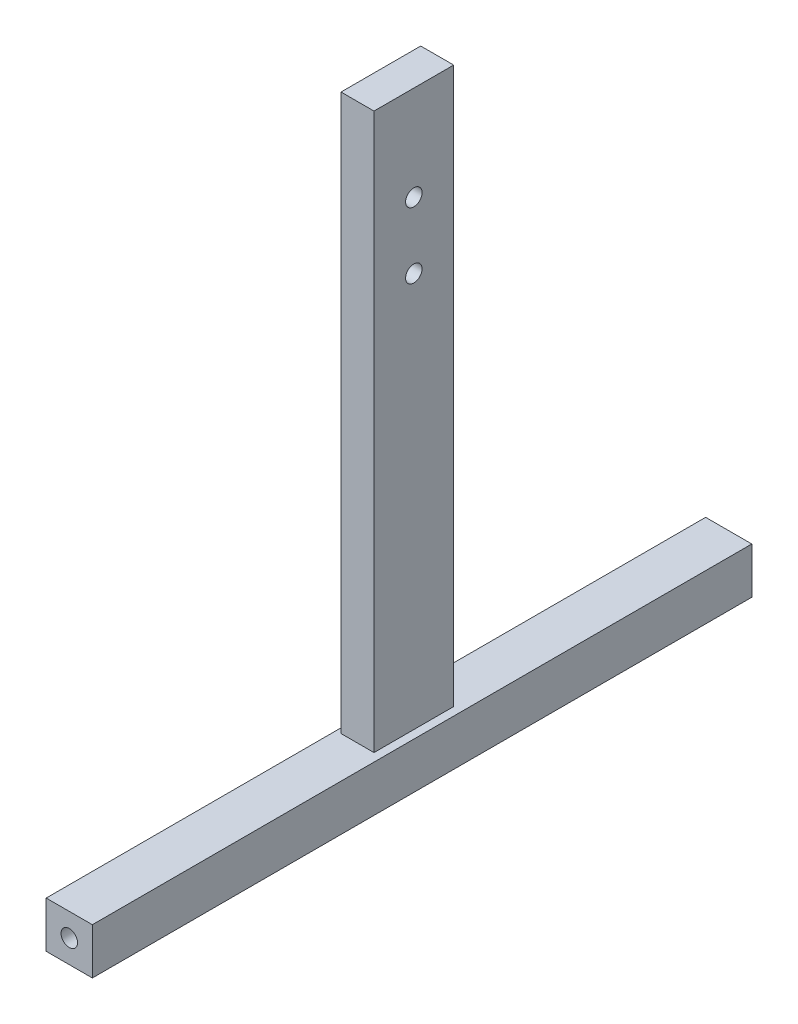
ISO-10303-21;
HEADER;
FILE_DESCRIPTION(('STEP AP214'),'2;1');
FILE_NAME('part.step','',(''),(''),'','','');
FILE_SCHEMA(('AUTOMOTIVE_DESIGN { 1 0 10303 214 1 1 1 1 }'));
ENDSEC;
DATA;
#1=APPLICATION_CONTEXT('core data for automotive mechanical design processes');
#2=APPLICATION_PROTOCOL_DEFINITION('international standard','automotive_design',2000,#1);
#3=PRODUCT_CONTEXT('',#1,'mechanical');
#4=PRODUCT('Part','Part','',(#3));
#5=PRODUCT_RELATED_PRODUCT_CATEGORY('part','',(#4));
#6=PRODUCT_DEFINITION_FORMATION('','',#4);
#7=PRODUCT_DEFINITION_CONTEXT('part definition',#1,'design');
#8=PRODUCT_DEFINITION('design','',#6,#7);
#9=PRODUCT_DEFINITION_SHAPE('','',#8);
#10=(LENGTH_UNIT() NAMED_UNIT(*) SI_UNIT(.MILLI.,.METRE.));
#11=(NAMED_UNIT(*) PLANE_ANGLE_UNIT() SI_UNIT($,.RADIAN.));
#12=(NAMED_UNIT(*) SI_UNIT($,.STERADIAN.) SOLID_ANGLE_UNIT());
#13=UNCERTAINTY_MEASURE_WITH_UNIT(LENGTH_MEASURE(1.E-05),#10,'distance_accuracy_value','');
#14=(GEOMETRIC_REPRESENTATION_CONTEXT(3) GLOBAL_UNCERTAINTY_ASSIGNED_CONTEXT((#13)) GLOBAL_UNIT_ASSIGNED_CONTEXT((#10,
#11,#12)) REPRESENTATION_CONTEXT('',''));
#15=CARTESIAN_POINT('',(0.,0.,0.));
#16=DIRECTION('',(0.,0.,1.));
#17=DIRECTION('',(1.,0.,0.));
#18=AXIS2_PLACEMENT_3D('',#15,#16,#17);
#19=CARTESIAN_POINT('',(11.43,445.77,284.697347519247));
#20=DIRECTION('',(-1.,0.,0.));
#21=DIRECTION('',(0.,0.,1.));
#22=AXIS2_PLACEMENT_3D('',#19,#20,#21);
#23=PLANE('',#22);
#24=CARTESIAN_POINT('',(11.43,372.872,253.999999999999));
#25=DIRECTION('',(-1.,0.,0.));
#26=DIRECTION('',(0.,0.,1.));
#27=AXIS2_PLACEMENT_3D('',#24,#25,#26);
#28=CIRCLE('',#27,6.34999999999999);
#29=CARTESIAN_POINT('',(11.43,372.872,260.349999999999));
#30=VERTEX_POINT('',#29);
#31=EDGE_CURVE('E140',#30,#30,#28,.T.);
#32=ORIENTED_EDGE('',*,*,#31,.T.);
#33=EDGE_LOOP('',(#32));
#34=FACE_BOUND('',#33,.T.);
#35=CARTESIAN_POINT('',(11.43,322.072,253.999999999999));
#36=DIRECTION('',(-1.,0.,0.));
#37=DIRECTION('',(0.,0.,1.));
#38=AXIS2_PLACEMENT_3D('',#35,#36,#37);
#39=CIRCLE('',#38,6.34999999999994);
#40=CARTESIAN_POINT('',(11.43,322.072,260.349999999999));
#41=VERTEX_POINT('',#40);
#42=EDGE_CURVE('E162',#41,#41,#39,.T.);
#43=ORIENTED_EDGE('',*,*,#42,.T.);
#44=EDGE_LOOP('',(#43));
#45=FACE_BOUND('',#44,.T.);
#46=DIRECTION('',(0.,0.,-1.));
#47=VECTOR('',#46,1.);
#48=CARTESIAN_POINT('',(11.43,17.78,284.697347519247));
#49=LINE('',#48,#47);
#50=CARTESIAN_POINT('',(11.43,17.78,284.697347519247));
#51=VERTEX_POINT('',#50);
#52=CARTESIAN_POINT('',(11.43,17.78,223.302652480753));
#53=VERTEX_POINT('',#52);
#54=EDGE_CURVE('E136',#51,#53,#49,.T.);
#55=ORIENTED_EDGE('',*,*,#54,.T.);
#56=DIRECTION('',(0.,-1.,0.));
#57=VECTOR('',#56,1.);
#58=CARTESIAN_POINT('',(11.43,445.77,223.302652480753));
#59=LINE('',#58,#57);
#60=CARTESIAN_POINT('',(11.43,445.77,223.302652480753));
#61=VERTEX_POINT('',#60);
#62=EDGE_CURVE('E12',#61,#53,#59,.T.);
#63=ORIENTED_EDGE('',*,*,#62,.F.);
#64=DIRECTION('',(0.,0.,-1.));
#65=VECTOR('',#64,1.);
#66=CARTESIAN_POINT('',(11.43,445.77,284.697347519247));
#67=LINE('',#66,#65);
#68=CARTESIAN_POINT('',(11.43,445.77,284.697347519247));
#69=VERTEX_POINT('',#68);
#70=EDGE_CURVE('E119',#69,#61,#67,.T.);
#71=ORIENTED_EDGE('',*,*,#70,.F.);
#72=DIRECTION('',(0.,-1.,0.));
#73=VECTOR('',#72,1.);
#74=CARTESIAN_POINT('',(11.43,445.77,284.697347519247));
#75=LINE('',#74,#73);
#76=EDGE_CURVE('E132',#69,#51,#75,.T.);
#77=ORIENTED_EDGE('',*,*,#76,.T.);
#78=EDGE_LOOP('',(#55,#63,#71,#77));
#79=FACE_BOUND('',#78,.T.);
#80=ADVANCED_FACE('F67',(#34,#45,#79),#23,.F.);
#81=CARTESIAN_POINT('',(-13.97,445.77,223.302652480753));
#82=DIRECTION('',(0.,0.,1.));
#83=DIRECTION('',(1.,0.,0.));
#84=AXIS2_PLACEMENT_3D('',#81,#82,#83);
#85=PLANE('',#84);
#86=DIRECTION('',(-1.,0.,0.));
#87=VECTOR('',#86,1.);
#88=CARTESIAN_POINT('',(-13.97,17.78,223.302652480753));
#89=LINE('',#88,#87);
#90=CARTESIAN_POINT('',(-13.97,17.78,223.302652480753));
#91=VERTEX_POINT('',#90);
#92=EDGE_CURVE('E124',#53,#91,#89,.T.);
#93=ORIENTED_EDGE('',*,*,#92,.T.);
#94=DIRECTION('',(0.,-1.,0.));
#95=VECTOR('',#94,1.);
#96=CARTESIAN_POINT('',(-13.97,445.77,223.302652480753));
#97=LINE('',#96,#95);
#98=CARTESIAN_POINT('',(-13.97,445.77,223.302652480753));
#99=VERTEX_POINT('',#98);
#100=EDGE_CURVE('E76',#99,#91,#97,.T.);
#101=ORIENTED_EDGE('',*,*,#100,.F.);
#102=DIRECTION('',(-1.,0.,0.));
#103=VECTOR('',#102,1.);
#104=CARTESIAN_POINT('',(-13.97,445.77,223.302652480753));
#105=LINE('',#104,#103);
#106=EDGE_CURVE('E114',#61,#99,#105,.T.);
#107=ORIENTED_EDGE('',*,*,#106,.F.);
#108=ORIENTED_EDGE('',*,*,#62,.T.);
#109=EDGE_LOOP('',(#93,#101,#107,#108));
#110=FACE_BOUND('',#109,.T.);
#111=ADVANCED_FACE('F123',(#110),#85,.F.);
#112=CARTESIAN_POINT('',(-13.97,445.77,284.697347519247));
#113=DIRECTION('',(1.,0.,0.));
#114=DIRECTION('',(0.,0.,-1.));
#115=AXIS2_PLACEMENT_3D('',#112,#113,#114);
#116=PLANE('',#115);
#117=CARTESIAN_POINT('',(-13.97,372.872,253.999999999999));
#118=DIRECTION('',(-1.,0.,0.));
#119=DIRECTION('',(0.,0.,1.));
#120=AXIS2_PLACEMENT_3D('',#117,#118,#119);
#121=CIRCLE('',#120,6.34999999999999);
#122=CARTESIAN_POINT('',(-13.97,372.872,260.349999999999));
#123=VERTEX_POINT('',#122);
#124=EDGE_CURVE('E166',#123,#123,#121,.T.);
#125=ORIENTED_EDGE('',*,*,#124,.F.);
#126=EDGE_LOOP('',(#125));
#127=FACE_BOUND('',#126,.T.);
#128=CARTESIAN_POINT('',(-13.97,322.072,253.999999999999));
#129=DIRECTION('',(-1.,0.,0.));
#130=DIRECTION('',(0.,0.,1.));
#131=AXIS2_PLACEMENT_3D('',#128,#129,#130);
#132=CIRCLE('',#131,6.34999999999994);
#133=CARTESIAN_POINT('',(-13.97,322.072,260.349999999999));
#134=VERTEX_POINT('',#133);
#135=EDGE_CURVE('E167',#134,#134,#132,.T.);
#136=ORIENTED_EDGE('',*,*,#135,.F.);
#137=EDGE_LOOP('',(#136));
#138=FACE_BOUND('',#137,.T.);
#139=DIRECTION('',(0.,0.,1.));
#140=VECTOR('',#139,1.);
#141=CARTESIAN_POINT('',(-13.97,17.78,284.697347519247));
#142=LINE('',#141,#140);
#143=CARTESIAN_POINT('',(-13.97,17.78,284.697347519247));
#144=VERTEX_POINT('',#143);
#145=EDGE_CURVE('E101',#91,#144,#142,.T.);
#146=ORIENTED_EDGE('',*,*,#145,.T.);
#147=DIRECTION('',(0.,-1.,0.));
#148=VECTOR('',#147,1.);
#149=CARTESIAN_POINT('',(-13.97,445.77,284.697347519247));
#150=LINE('',#149,#148);
#151=CARTESIAN_POINT('',(-13.97,445.77,284.697347519247));
#152=VERTEX_POINT('',#151);
#153=EDGE_CURVE('E126',#152,#144,#150,.T.);
#154=ORIENTED_EDGE('',*,*,#153,.F.);
#155=DIRECTION('',(0.,0.,1.));
#156=VECTOR('',#155,1.);
#157=CARTESIAN_POINT('',(-13.97,445.77,284.697347519247));
#158=LINE('',#157,#156);
#159=EDGE_CURVE('E117',#99,#152,#158,.T.);
#160=ORIENTED_EDGE('',*,*,#159,.F.);
#161=ORIENTED_EDGE('',*,*,#100,.T.);
#162=EDGE_LOOP('',(#146,#154,#160,#161));
#163=FACE_BOUND('',#162,.T.);
#164=ADVANCED_FACE('F127',(#127,#138,#163),#116,.F.);
#165=CARTESIAN_POINT('',(-13.97,445.77,284.697347519247));
#166=DIRECTION('',(0.,0.,-1.));
#167=DIRECTION('',(-1.,0.,0.));
#168=AXIS2_PLACEMENT_3D('',#165,#166,#167);
#169=PLANE('',#168);
#170=DIRECTION('',(1.,0.,0.));
#171=VECTOR('',#170,1.);
#172=CARTESIAN_POINT('',(-13.97,17.78,284.697347519247));
#173=LINE('',#172,#171);
#174=EDGE_CURVE('E107',#144,#51,#173,.T.);
#175=ORIENTED_EDGE('',*,*,#174,.T.);
#176=ORIENTED_EDGE('',*,*,#76,.F.);
#177=DIRECTION('',(1.,0.,0.));
#178=VECTOR('',#177,1.);
#179=CARTESIAN_POINT('',(-13.97,445.77,284.697347519247));
#180=LINE('',#179,#178);
#181=EDGE_CURVE('E84',#152,#69,#180,.T.);
#182=ORIENTED_EDGE('',*,*,#181,.F.);
#183=ORIENTED_EDGE('',*,*,#153,.T.);
#184=EDGE_LOOP('',(#175,#176,#182,#183));
#185=FACE_BOUND('',#184,.T.);
#186=ADVANCED_FACE('F151',(#185),#169,.F.);
#187=CARTESIAN_POINT('',(0.,445.77,0.));
#188=DIRECTION('',(0.,-1.,0.));
#189=DIRECTION('',(0.,0.,-1.));
#190=AXIS2_PLACEMENT_3D('',#187,#188,#189);
#191=PLANE('',#190);
#192=ORIENTED_EDGE('',*,*,#70,.T.);
#193=ORIENTED_EDGE('',*,*,#106,.T.);
#194=ORIENTED_EDGE('',*,*,#159,.T.);
#195=ORIENTED_EDGE('',*,*,#181,.T.);
#196=EDGE_LOOP('',(#192,#193,#194,#195));
#197=FACE_BOUND('',#196,.T.);
#198=ADVANCED_FACE('F115',(#197),#191,.F.);
#199=CARTESIAN_POINT('',(0.,17.78,0.));
#200=DIRECTION('',(0.,-1.,0.));
#201=DIRECTION('',(0.,0.,-1.));
#202=AXIS2_PLACEMENT_3D('',#199,#200,#201);
#203=PLANE('',#202);
#204=ORIENTED_EDGE('',*,*,#54,.F.);
#205=ORIENTED_EDGE('',*,*,#174,.F.);
#206=ORIENTED_EDGE('',*,*,#145,.F.);
#207=ORIENTED_EDGE('',*,*,#92,.F.);
#208=EDGE_LOOP('',(#204,#205,#206,#207));
#209=FACE_BOUND('',#208,.T.);
#210=ADVANCED_FACE('F154',(#209),#203,.T.);
#211=CARTESIAN_POINT('',(17.78,322.072,253.999999999999));
#212=DIRECTION('',(-1.,0.,0.));
#213=DIRECTION('',(0.,0.,1.));
#214=AXIS2_PLACEMENT_3D('',#211,#212,#213);
#215=CYLINDRICAL_SURFACE('',#214,6.34999999999994);
#216=ORIENTED_EDGE('',*,*,#135,.T.);
#217=EDGE_LOOP('',(#216));
#218=FACE_BOUND('',#217,.T.);
#219=ORIENTED_EDGE('',*,*,#42,.F.);
#220=EDGE_LOOP('',(#219));
#221=FACE_BOUND('',#220,.T.);
#222=ADVANCED_FACE('F184',(#218,#221),#215,.F.);
#223=CARTESIAN_POINT('',(17.78,372.872,253.999999999999));
#224=DIRECTION('',(-1.,0.,0.));
#225=DIRECTION('',(0.,0.,1.));
#226=AXIS2_PLACEMENT_3D('',#223,#224,#225);
#227=CYLINDRICAL_SURFACE('',#226,6.34999999999999);
#228=ORIENTED_EDGE('',*,*,#124,.T.);
#229=EDGE_LOOP('',(#228));
#230=FACE_BOUND('',#229,.T.);
#231=ORIENTED_EDGE('',*,*,#31,.F.);
#232=EDGE_LOOP('',(#231));
#233=FACE_BOUND('',#232,.T.);
#234=ADVANCED_FACE('F176',(#230,#233),#227,.F.);
#235=CLOSED_SHELL('',(#80,#111,#164,#186,#198,#210,#222,#234));
#236=MANIFOLD_SOLID_BREP('B2',#235);
#237=CARTESIAN_POINT('',(17.78,17.78,508.));
#238=DIRECTION('',(-1.,0.,0.));
#239=DIRECTION('',(0.,-1.,0.));
#240=AXIS2_PLACEMENT_3D('',#237,#238,#239);
#241=PLANE('',#240);
#242=DIRECTION('',(0.,1.,0.));
#243=VECTOR('',#242,1.);
#244=CARTESIAN_POINT('',(17.78,17.78,0.));
#245=LINE('',#244,#243);
#246=CARTESIAN_POINT('',(17.78,-17.78,0.));
#247=VERTEX_POINT('',#246);
#248=CARTESIAN_POINT('',(17.78,17.78,0.));
#249=VERTEX_POINT('',#248);
#250=EDGE_CURVE('E356',#247,#249,#245,.T.);
#251=ORIENTED_EDGE('',*,*,#250,.T.);
#252=DIRECTION('',(0.,0.,-1.));
#253=VECTOR('',#252,1.);
#254=CARTESIAN_POINT('',(17.78,17.78,508.));
#255=LINE('',#254,#253);
#256=CARTESIAN_POINT('',(17.78,17.78,508.));
#257=VERTEX_POINT('',#256);
#258=EDGE_CURVE('E65',#257,#249,#255,.T.);
#259=ORIENTED_EDGE('',*,*,#258,.F.);
#260=DIRECTION('',(0.,1.,0.));
#261=VECTOR('',#260,1.);
#262=CARTESIAN_POINT('',(17.78,17.78,508.));
#263=LINE('',#262,#261);
#264=CARTESIAN_POINT('',(17.78,-17.78,508.));
#265=VERTEX_POINT('',#264);
#266=EDGE_CURVE('E339',#265,#257,#263,.T.);
#267=ORIENTED_EDGE('',*,*,#266,.F.);
#268=DIRECTION('',(0.,0.,-1.));
#269=VECTOR('',#268,1.);
#270=CARTESIAN_POINT('',(17.78,-17.78,508.));
#271=LINE('',#270,#269);
#272=EDGE_CURVE('E352',#265,#247,#271,.T.);
#273=ORIENTED_EDGE('',*,*,#272,.T.);
#274=EDGE_LOOP('',(#251,#259,#267,#273));
#275=FACE_BOUND('',#274,.T.);
#276=ADVANCED_FACE('F287',(#275),#241,.F.);
#277=CARTESIAN_POINT('',(-17.78,17.78,508.));
#278=DIRECTION('',(0.,-1.,0.));
#279=DIRECTION('',(0.,0.,-1.));
#280=AXIS2_PLACEMENT_3D('',#277,#278,#279);
#281=PLANE('',#280);
#282=DIRECTION('',(-1.,0.,0.));
#283=VECTOR('',#282,1.);
#284=CARTESIAN_POINT('',(-17.78,17.78,0.));
#285=LINE('',#284,#283);
#286=CARTESIAN_POINT('',(-17.78,17.78,0.));
#287=VERTEX_POINT('',#286);
#288=EDGE_CURVE('E344',#249,#287,#285,.T.);
#289=ORIENTED_EDGE('',*,*,#288,.T.);
#290=DIRECTION('',(0.,0.,-1.));
#291=VECTOR('',#290,1.);
#292=CARTESIAN_POINT('',(-17.78,17.78,508.));
#293=LINE('',#292,#291);
#294=CARTESIAN_POINT('',(-17.78,17.78,508.));
#295=VERTEX_POINT('',#294);
#296=EDGE_CURVE('E296',#295,#287,#293,.T.);
#297=ORIENTED_EDGE('',*,*,#296,.F.);
#298=DIRECTION('',(-1.,0.,0.));
#299=VECTOR('',#298,1.);
#300=CARTESIAN_POINT('',(-17.78,17.78,508.));
#301=LINE('',#300,#299);
#302=EDGE_CURVE('E334',#257,#295,#301,.T.);
#303=ORIENTED_EDGE('',*,*,#302,.F.);
#304=ORIENTED_EDGE('',*,*,#258,.T.);
#305=EDGE_LOOP('',(#289,#297,#303,#304));
#306=FACE_BOUND('',#305,.T.);
#307=ADVANCED_FACE('F343',(#306),#281,.F.);
#308=CARTESIAN_POINT('',(-17.78,17.78,508.));
#309=DIRECTION('',(1.,0.,0.));
#310=DIRECTION('',(0.,1.,0.));
#311=AXIS2_PLACEMENT_3D('',#308,#309,#310);
#312=PLANE('',#311);
#313=DIRECTION('',(0.,-1.,0.));
#314=VECTOR('',#313,1.);
#315=CARTESIAN_POINT('',(-17.78,17.78,0.));
#316=LINE('',#315,#314);
#317=CARTESIAN_POINT('',(-17.78,-17.78,0.));
#318=VERTEX_POINT('',#317);
#319=EDGE_CURVE('E321',#287,#318,#316,.T.);
#320=ORIENTED_EDGE('',*,*,#319,.T.);
#321=DIRECTION('',(0.,0.,-1.));
#322=VECTOR('',#321,1.);
#323=CARTESIAN_POINT('',(-17.78,-17.78,508.));
#324=LINE('',#323,#322);
#325=CARTESIAN_POINT('',(-17.78,-17.78,508.));
#326=VERTEX_POINT('',#325);
#327=EDGE_CURVE('E346',#326,#318,#324,.T.);
#328=ORIENTED_EDGE('',*,*,#327,.F.);
#329=DIRECTION('',(0.,-1.,0.));
#330=VECTOR('',#329,1.);
#331=CARTESIAN_POINT('',(-17.78,17.78,508.));
#332=LINE('',#331,#330);
#333=EDGE_CURVE('E337',#295,#326,#332,.T.);
#334=ORIENTED_EDGE('',*,*,#333,.F.);
#335=ORIENTED_EDGE('',*,*,#296,.T.);
#336=EDGE_LOOP('',(#320,#328,#334,#335));
#337=FACE_BOUND('',#336,.T.);
#338=ADVANCED_FACE('F347',(#337),#312,.F.);
#339=CARTESIAN_POINT('',(-17.78,-17.78,508.));
#340=DIRECTION('',(0.,1.,0.));
#341=DIRECTION('',(0.,0.,1.));
#342=AXIS2_PLACEMENT_3D('',#339,#340,#341);
#343=PLANE('',#342);
#344=DIRECTION('',(1.,0.,0.));
#345=VECTOR('',#344,1.);
#346=CARTESIAN_POINT('',(-17.78,-17.78,0.));
#347=LINE('',#346,#345);
#348=EDGE_CURVE('E327',#318,#247,#347,.T.);
#349=ORIENTED_EDGE('',*,*,#348,.T.);
#350=ORIENTED_EDGE('',*,*,#272,.F.);
#351=DIRECTION('',(1.,0.,0.));
#352=VECTOR('',#351,1.);
#353=CARTESIAN_POINT('',(-17.78,-17.78,508.));
#354=LINE('',#353,#352);
#355=EDGE_CURVE('E304',#326,#265,#354,.T.);
#356=ORIENTED_EDGE('',*,*,#355,.F.);
#357=ORIENTED_EDGE('',*,*,#327,.T.);
#358=EDGE_LOOP('',(#349,#350,#356,#357));
#359=FACE_BOUND('',#358,.T.);
#360=ADVANCED_FACE('F371',(#359),#343,.F.);
#361=CARTESIAN_POINT('',(0.,0.,508.));
#362=DIRECTION('',(0.,0.,1.));
#363=DIRECTION('',(1.,0.,0.));
#364=AXIS2_PLACEMENT_3D('',#361,#362,#363);
#365=PLANE('',#364);
#366=CARTESIAN_POINT('',(0.,0.,508.));
#367=DIRECTION('',(0.,0.,1.));
#368=DIRECTION('',(1.,0.,0.));
#369=AXIS2_PLACEMENT_3D('',#366,#367,#368);
#370=CIRCLE('',#369,6.35);
#371=CARTESIAN_POINT('',(6.35,0.,508.));
#372=VERTEX_POINT('',#371);
#373=EDGE_CURVE('E379',#372,#372,#370,.T.);
#374=ORIENTED_EDGE('',*,*,#373,.F.);
#375=EDGE_LOOP('',(#374));
#376=FACE_BOUND('',#375,.T.);
#377=ORIENTED_EDGE('',*,*,#266,.T.);
#378=ORIENTED_EDGE('',*,*,#302,.T.);
#379=ORIENTED_EDGE('',*,*,#333,.T.);
#380=ORIENTED_EDGE('',*,*,#355,.T.);
#381=EDGE_LOOP('',(#377,#378,#379,#380));
#382=FACE_BOUND('',#381,.T.);
#383=ADVANCED_FACE('F335',(#376,#382),#365,.T.);
#384=CARTESIAN_POINT('',(0.,0.,0.));
#385=DIRECTION('',(0.,0.,1.));
#386=DIRECTION('',(1.,0.,0.));
#387=AXIS2_PLACEMENT_3D('',#384,#385,#386);
#388=PLANE('',#387);
#389=CARTESIAN_POINT('',(0.,0.,0.));
#390=DIRECTION('',(0.,0.,1.));
#391=DIRECTION('',(1.,0.,0.));
#392=AXIS2_PLACEMENT_3D('',#389,#390,#391);
#393=CIRCLE('',#392,6.35);
#394=CARTESIAN_POINT('',(6.35,0.,0.));
#395=VERTEX_POINT('',#394);
#396=EDGE_CURVE('E360',#395,#395,#393,.T.);
#397=ORIENTED_EDGE('',*,*,#396,.T.);
#398=EDGE_LOOP('',(#397));
#399=FACE_BOUND('',#398,.T.);
#400=ORIENTED_EDGE('',*,*,#250,.F.);
#401=ORIENTED_EDGE('',*,*,#348,.F.);
#402=ORIENTED_EDGE('',*,*,#319,.F.);
#403=ORIENTED_EDGE('',*,*,#288,.F.);
#404=EDGE_LOOP('',(#400,#401,#402,#403));
#405=FACE_BOUND('',#404,.T.);
#406=ADVANCED_FACE('F374',(#399,#405),#388,.F.);
#407=CARTESIAN_POINT('',(0.,0.,0.));
#408=DIRECTION('',(0.,0.,1.));
#409=DIRECTION('',(1.,0.,0.));
#410=AXIS2_PLACEMENT_3D('',#407,#408,#409);
#411=CYLINDRICAL_SURFACE('',#410,6.35);
#412=ORIENTED_EDGE('',*,*,#396,.F.);
#413=EDGE_LOOP('',(#412));
#414=FACE_BOUND('',#413,.T.);
#415=ORIENTED_EDGE('',*,*,#373,.T.);
#416=EDGE_LOOP('',(#415));
#417=FACE_BOUND('',#416,.T.);
#418=ADVANCED_FACE('F389',(#414,#417),#411,.F.);
#419=CLOSED_SHELL('',(#276,#307,#338,#360,#383,#406,#418));
#420=MANIFOLD_SOLID_BREP('B6',#419);
#421=ADVANCED_BREP_SHAPE_REPRESENTATION('',(#18,#236,#420),#14);
#422=SHAPE_DEFINITION_REPRESENTATION(#9,#421);
ENDSEC;
END-ISO-10303-21;
